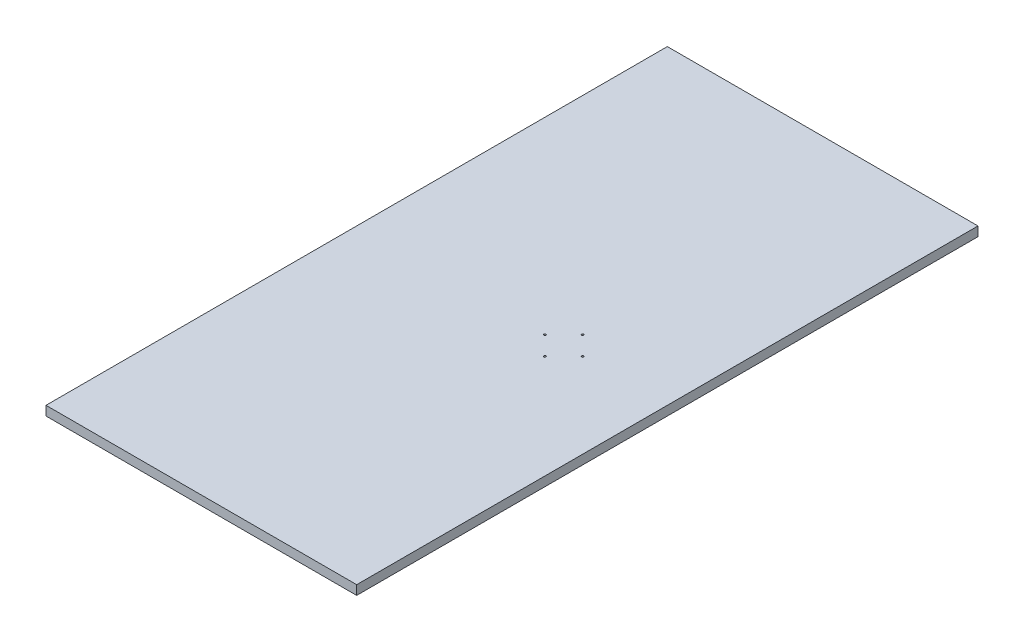
ISO-10303-21;
HEADER;
FILE_DESCRIPTION(('STEP AP214'),'2;1');
FILE_NAME('part.step','',(''),(''),'','','');
FILE_SCHEMA(('AUTOMOTIVE_DESIGN { 1 0 10303 214 1 1 1 1 }'));
ENDSEC;
DATA;
#1=APPLICATION_CONTEXT('core data for automotive mechanical design processes');
#2=APPLICATION_PROTOCOL_DEFINITION('international standard','automotive_design',2000,#1);
#3=PRODUCT_CONTEXT('',#1,'mechanical');
#4=PRODUCT('Part','Part','',(#3));
#5=PRODUCT_RELATED_PRODUCT_CATEGORY('part','',(#4));
#6=PRODUCT_DEFINITION_FORMATION('','',#4);
#7=PRODUCT_DEFINITION_CONTEXT('part definition',#1,'design');
#8=PRODUCT_DEFINITION('design','',#6,#7);
#9=PRODUCT_DEFINITION_SHAPE('','',#8);
#10=(LENGTH_UNIT() NAMED_UNIT(*) SI_UNIT(.MILLI.,.METRE.));
#11=(NAMED_UNIT(*) PLANE_ANGLE_UNIT() SI_UNIT($,.RADIAN.));
#12=(NAMED_UNIT(*) SI_UNIT($,.STERADIAN.) SOLID_ANGLE_UNIT());
#13=UNCERTAINTY_MEASURE_WITH_UNIT(LENGTH_MEASURE(1.E-05),#10,'distance_accuracy_value','');
#14=(GEOMETRIC_REPRESENTATION_CONTEXT(3) GLOBAL_UNCERTAINTY_ASSIGNED_CONTEXT((#13)) GLOBAL_UNIT_ASSIGNED_CONTEXT((#10,
#11,#12)) REPRESENTATION_CONTEXT('',''));
#15=CARTESIAN_POINT('',(0.,0.,0.));
#16=DIRECTION('',(0.,0.,1.));
#17=DIRECTION('',(1.,0.,0.));
#18=AXIS2_PLACEMENT_3D('',#15,#16,#17);
#19=CARTESIAN_POINT('',(300.,18.,600.));
#20=DIRECTION('',(-1.,0.,0.));
#21=DIRECTION('',(0.,0.,1.));
#22=AXIS2_PLACEMENT_3D('',#19,#20,#21);
#23=PLANE('',#22);
#24=DIRECTION('',(0.,0.,-1.));
#25=VECTOR('',#24,1.);
#26=CARTESIAN_POINT('',(300.,0.,600.));
#27=LINE('',#26,#25);
#28=CARTESIAN_POINT('',(300.,0.,600.));
#29=VERTEX_POINT('',#28);
#30=CARTESIAN_POINT('',(300.,0.,-600.));
#31=VERTEX_POINT('',#30);
#32=EDGE_CURVE('E102',#29,#31,#27,.T.);
#33=ORIENTED_EDGE('',*,*,#32,.T.);
#34=DIRECTION('',(0.,-1.,0.));
#35=VECTOR('',#34,1.);
#36=CARTESIAN_POINT('',(300.,18.,-600.));
#37=LINE('',#36,#35);
#38=CARTESIAN_POINT('',(300.,18.,-600.));
#39=VERTEX_POINT('',#38);
#40=EDGE_CURVE('E11',#39,#31,#37,.T.);
#41=ORIENTED_EDGE('',*,*,#40,.F.);
#42=DIRECTION('',(0.,0.,-1.));
#43=VECTOR('',#42,1.);
#44=CARTESIAN_POINT('',(300.,18.,600.));
#45=LINE('',#44,#43);
#46=CARTESIAN_POINT('',(300.,18.,600.));
#47=VERTEX_POINT('',#46);
#48=EDGE_CURVE('E90',#47,#39,#45,.T.);
#49=ORIENTED_EDGE('',*,*,#48,.F.);
#50=DIRECTION('',(0.,-1.,0.));
#51=VECTOR('',#50,1.);
#52=CARTESIAN_POINT('',(300.,18.,600.));
#53=LINE('',#52,#51);
#54=EDGE_CURVE('E98',#47,#29,#53,.T.);
#55=ORIENTED_EDGE('',*,*,#54,.T.);
#56=EDGE_LOOP('',(#33,#41,#49,#55));
#57=FACE_BOUND('',#56,.T.);
#58=ADVANCED_FACE('F39',(#57),#23,.F.);
#59=CARTESIAN_POINT('',(-300.,18.,-600.));
#60=DIRECTION('',(0.,0.,1.));
#61=DIRECTION('',(1.,0.,0.));
#62=AXIS2_PLACEMENT_3D('',#59,#60,#61);
#63=PLANE('',#62);
#64=DIRECTION('',(-1.,0.,0.));
#65=VECTOR('',#64,1.);
#66=CARTESIAN_POINT('',(-300.,0.,-600.));
#67=LINE('',#66,#65);
#68=CARTESIAN_POINT('',(-300.,0.,-600.));
#69=VERTEX_POINT('',#68);
#70=EDGE_CURVE('E94',#31,#69,#67,.T.);
#71=ORIENTED_EDGE('',*,*,#70,.T.);
#72=DIRECTION('',(0.,-1.,0.));
#73=VECTOR('',#72,1.);
#74=CARTESIAN_POINT('',(-300.,18.,-600.));
#75=LINE('',#74,#73);
#76=CARTESIAN_POINT('',(-300.,18.,-600.));
#77=VERTEX_POINT('',#76);
#78=EDGE_CURVE('E47',#77,#69,#75,.T.);
#79=ORIENTED_EDGE('',*,*,#78,.F.);
#80=DIRECTION('',(-1.,0.,0.));
#81=VECTOR('',#80,1.);
#82=CARTESIAN_POINT('',(-300.,18.,-600.));
#83=LINE('',#82,#81);
#84=EDGE_CURVE('E85',#39,#77,#83,.T.);
#85=ORIENTED_EDGE('',*,*,#84,.F.);
#86=ORIENTED_EDGE('',*,*,#40,.T.);
#87=EDGE_LOOP('',(#71,#79,#85,#86));
#88=FACE_BOUND('',#87,.T.);
#89=ADVANCED_FACE('F93',(#88),#63,.F.);
#90=CARTESIAN_POINT('',(-300.,18.,600.));
#91=DIRECTION('',(1.,0.,0.));
#92=DIRECTION('',(0.,0.,-1.));
#93=AXIS2_PLACEMENT_3D('',#90,#91,#92);
#94=PLANE('',#93);
#95=DIRECTION('',(0.,0.,1.));
#96=VECTOR('',#95,1.);
#97=CARTESIAN_POINT('',(-300.,0.,600.));
#98=LINE('',#97,#96);
#99=CARTESIAN_POINT('',(-300.,0.,600.));
#100=VERTEX_POINT('',#99);
#101=EDGE_CURVE('E72',#69,#100,#98,.T.);
#102=ORIENTED_EDGE('',*,*,#101,.T.);
#103=DIRECTION('',(0.,-1.,0.));
#104=VECTOR('',#103,1.);
#105=CARTESIAN_POINT('',(-300.,18.,600.));
#106=LINE('',#105,#104);
#107=CARTESIAN_POINT('',(-300.,18.,600.));
#108=VERTEX_POINT('',#107);
#109=EDGE_CURVE('E95',#108,#100,#106,.T.);
#110=ORIENTED_EDGE('',*,*,#109,.F.);
#111=DIRECTION('',(0.,0.,1.));
#112=VECTOR('',#111,1.);
#113=CARTESIAN_POINT('',(-300.,18.,600.));
#114=LINE('',#113,#112);
#115=EDGE_CURVE('E88',#77,#108,#114,.T.);
#116=ORIENTED_EDGE('',*,*,#115,.F.);
#117=ORIENTED_EDGE('',*,*,#78,.T.);
#118=EDGE_LOOP('',(#102,#110,#116,#117));
#119=FACE_BOUND('',#118,.T.);
#120=ADVANCED_FACE('F96',(#119),#94,.F.);
#121=CARTESIAN_POINT('',(-300.,18.,600.));
#122=DIRECTION('',(0.,0.,-1.));
#123=DIRECTION('',(-1.,0.,0.));
#124=AXIS2_PLACEMENT_3D('',#121,#122,#123);
#125=PLANE('',#124);
#126=DIRECTION('',(1.,0.,0.));
#127=VECTOR('',#126,1.);
#128=CARTESIAN_POINT('',(-300.,0.,600.));
#129=LINE('',#128,#127);
#130=EDGE_CURVE('E78',#100,#29,#129,.T.);
#131=ORIENTED_EDGE('',*,*,#130,.T.);
#132=ORIENTED_EDGE('',*,*,#54,.F.);
#133=DIRECTION('',(1.,0.,0.));
#134=VECTOR('',#133,1.);
#135=CARTESIAN_POINT('',(-300.,18.,600.));
#136=LINE('',#135,#134);
#137=EDGE_CURVE('E55',#108,#47,#136,.T.);
#138=ORIENTED_EDGE('',*,*,#137,.F.);
#139=ORIENTED_EDGE('',*,*,#109,.T.);
#140=EDGE_LOOP('',(#131,#132,#138,#139));
#141=FACE_BOUND('',#140,.T.);
#142=ADVANCED_FACE('F110',(#141),#125,.F.);
#143=CARTESIAN_POINT('',(0.,18.,0.));
#144=DIRECTION('',(0.,-1.,0.));
#145=DIRECTION('',(0.,0.,-1.));
#146=AXIS2_PLACEMENT_3D('',#143,#144,#145);
#147=PLANE('',#146);
#148=CARTESIAN_POINT('',(100.,18.,-36.5));
#149=DIRECTION('',(0.,1.,0.));
#150=DIRECTION('',(0.,0.,1.));
#151=AXIS2_PLACEMENT_3D('',#148,#149,#150);
#152=CIRCLE('',#151,2.);
#153=CARTESIAN_POINT('',(100.,18.,-34.5));
#154=VERTEX_POINT('',#153);
#155=EDGE_CURVE('E134',#154,#154,#152,.T.);
#156=ORIENTED_EDGE('',*,*,#155,.F.);
#157=EDGE_LOOP('',(#156));
#158=FACE_BOUND('',#157,.T.);
#159=CARTESIAN_POINT('',(100.,18.,36.5));
#160=DIRECTION('',(0.,1.,0.));
#161=DIRECTION('',(0.,0.,1.));
#162=AXIS2_PLACEMENT_3D('',#159,#160,#161);
#163=CIRCLE('',#162,2.);
#164=CARTESIAN_POINT('',(100.,18.,38.5));
#165=VERTEX_POINT('',#164);
#166=EDGE_CURVE('E128',#165,#165,#163,.T.);
#167=ORIENTED_EDGE('',*,*,#166,.F.);
#168=EDGE_LOOP('',(#167));
#169=FACE_BOUND('',#168,.T.);
#170=CARTESIAN_POINT('',(136.5,18.,0.));
#171=DIRECTION('',(0.,1.,0.));
#172=DIRECTION('',(0.,0.,1.));
#173=AXIS2_PLACEMENT_3D('',#170,#171,#172);
#174=CIRCLE('',#173,2.);
#175=CARTESIAN_POINT('',(136.5,18.,2.));
#176=VERTEX_POINT('',#175);
#177=EDGE_CURVE('E122',#176,#176,#174,.T.);
#178=ORIENTED_EDGE('',*,*,#177,.F.);
#179=EDGE_LOOP('',(#178));
#180=FACE_BOUND('',#179,.T.);
#181=CARTESIAN_POINT('',(63.5000000000001,18.,0.));
#182=DIRECTION('',(0.,1.,0.));
#183=DIRECTION('',(0.,0.,1.));
#184=AXIS2_PLACEMENT_3D('',#181,#182,#183);
#185=CIRCLE('',#184,2.);
#186=CARTESIAN_POINT('',(63.5000000000001,18.,2.));
#187=VERTEX_POINT('',#186);
#188=EDGE_CURVE('E116',#187,#187,#185,.T.);
#189=ORIENTED_EDGE('',*,*,#188,.F.);
#190=EDGE_LOOP('',(#189));
#191=FACE_BOUND('',#190,.T.);
#192=ORIENTED_EDGE('',*,*,#48,.T.);
#193=ORIENTED_EDGE('',*,*,#84,.T.);
#194=ORIENTED_EDGE('',*,*,#115,.T.);
#195=ORIENTED_EDGE('',*,*,#137,.T.);
#196=EDGE_LOOP('',(#192,#193,#194,#195));
#197=FACE_BOUND('',#196,.T.);
#198=ADVANCED_FACE('F86',(#158,#169,#180,#191,#197),#147,.F.);
#199=CARTESIAN_POINT('',(0.,0.,0.));
#200=DIRECTION('',(0.,-1.,0.));
#201=DIRECTION('',(0.,0.,-1.));
#202=AXIS2_PLACEMENT_3D('',#199,#200,#201);
#203=PLANE('',#202);
#204=CARTESIAN_POINT('',(100.,0.,-36.5));
#205=DIRECTION('',(0.,1.,0.));
#206=DIRECTION('',(0.,0.,1.));
#207=AXIS2_PLACEMENT_3D('',#204,#205,#206);
#208=CIRCLE('',#207,2.);
#209=CARTESIAN_POINT('',(100.,0.,-34.5));
#210=VERTEX_POINT('',#209);
#211=EDGE_CURVE('E105',#210,#210,#208,.T.);
#212=ORIENTED_EDGE('',*,*,#211,.T.);
#213=EDGE_LOOP('',(#212));
#214=FACE_BOUND('',#213,.T.);
#215=CARTESIAN_POINT('',(100.,0.,36.5));
#216=DIRECTION('',(0.,1.,0.));
#217=DIRECTION('',(0.,0.,1.));
#218=AXIS2_PLACEMENT_3D('',#215,#216,#217);
#219=CIRCLE('',#218,2.);
#220=CARTESIAN_POINT('',(100.,0.,38.5));
#221=VERTEX_POINT('',#220);
#222=EDGE_CURVE('E131',#221,#221,#219,.T.);
#223=ORIENTED_EDGE('',*,*,#222,.T.);
#224=EDGE_LOOP('',(#223));
#225=FACE_BOUND('',#224,.T.);
#226=CARTESIAN_POINT('',(136.5,0.,0.));
#227=DIRECTION('',(0.,1.,0.));
#228=DIRECTION('',(0.,0.,1.));
#229=AXIS2_PLACEMENT_3D('',#226,#227,#228);
#230=CIRCLE('',#229,2.);
#231=CARTESIAN_POINT('',(136.5,0.,2.));
#232=VERTEX_POINT('',#231);
#233=EDGE_CURVE('E125',#232,#232,#230,.T.);
#234=ORIENTED_EDGE('',*,*,#233,.T.);
#235=EDGE_LOOP('',(#234));
#236=FACE_BOUND('',#235,.T.);
#237=CARTESIAN_POINT('',(63.5000000000001,0.,0.));
#238=DIRECTION('',(0.,1.,0.));
#239=DIRECTION('',(0.,0.,1.));
#240=AXIS2_PLACEMENT_3D('',#237,#238,#239);
#241=CIRCLE('',#240,2.);
#242=CARTESIAN_POINT('',(63.5000000000001,0.,2.));
#243=VERTEX_POINT('',#242);
#244=EDGE_CURVE('E119',#243,#243,#241,.T.);
#245=ORIENTED_EDGE('',*,*,#244,.T.);
#246=EDGE_LOOP('',(#245));
#247=FACE_BOUND('',#246,.T.);
#248=ORIENTED_EDGE('',*,*,#32,.F.);
#249=ORIENTED_EDGE('',*,*,#130,.F.);
#250=ORIENTED_EDGE('',*,*,#101,.F.);
#251=ORIENTED_EDGE('',*,*,#70,.F.);
#252=EDGE_LOOP('',(#248,#249,#250,#251));
#253=FACE_BOUND('',#252,.T.);
#254=ADVANCED_FACE('F113',(#214,#225,#236,#247,#253),#203,.T.);
#255=CARTESIAN_POINT('',(63.5000000000001,0.,0.));
#256=DIRECTION('',(0.,1.,0.));
#257=DIRECTION('',(0.,0.,1.));
#258=AXIS2_PLACEMENT_3D('',#255,#256,#257);
#259=CYLINDRICAL_SURFACE('',#258,2.);
#260=ORIENTED_EDGE('',*,*,#244,.F.);
#261=EDGE_LOOP('',(#260));
#262=FACE_BOUND('',#261,.T.);
#263=ORIENTED_EDGE('',*,*,#188,.T.);
#264=EDGE_LOOP('',(#263));
#265=FACE_BOUND('',#264,.T.);
#266=ADVANCED_FACE('F158',(#262,#265),#259,.F.);
#267=CARTESIAN_POINT('',(136.5,0.,0.));
#268=DIRECTION('',(0.,1.,0.));
#269=DIRECTION('',(0.,0.,1.));
#270=AXIS2_PLACEMENT_3D('',#267,#268,#269);
#271=CYLINDRICAL_SURFACE('',#270,2.);
#272=ORIENTED_EDGE('',*,*,#233,.F.);
#273=EDGE_LOOP('',(#272));
#274=FACE_BOUND('',#273,.T.);
#275=ORIENTED_EDGE('',*,*,#177,.T.);
#276=EDGE_LOOP('',(#275));
#277=FACE_BOUND('',#276,.T.);
#278=ADVANCED_FACE('F160',(#274,#277),#271,.F.);
#279=CARTESIAN_POINT('',(100.,0.,36.5));
#280=DIRECTION('',(0.,1.,0.));
#281=DIRECTION('',(0.,0.,1.));
#282=AXIS2_PLACEMENT_3D('',#279,#280,#281);
#283=CYLINDRICAL_SURFACE('',#282,2.);
#284=ORIENTED_EDGE('',*,*,#222,.F.);
#285=EDGE_LOOP('',(#284));
#286=FACE_BOUND('',#285,.T.);
#287=ORIENTED_EDGE('',*,*,#166,.T.);
#288=EDGE_LOOP('',(#287));
#289=FACE_BOUND('',#288,.T.);
#290=ADVANCED_FACE('F145',(#286,#289),#283,.F.);
#291=CARTESIAN_POINT('',(100.,0.,-36.5));
#292=DIRECTION('',(0.,1.,0.));
#293=DIRECTION('',(0.,0.,1.));
#294=AXIS2_PLACEMENT_3D('',#291,#292,#293);
#295=CYLINDRICAL_SURFACE('',#294,2.);
#296=ORIENTED_EDGE('',*,*,#211,.F.);
#297=EDGE_LOOP('',(#296));
#298=FACE_BOUND('',#297,.T.);
#299=ORIENTED_EDGE('',*,*,#155,.T.);
#300=EDGE_LOOP('',(#299));
#301=FACE_BOUND('',#300,.T.);
#302=ADVANCED_FACE('F142',(#298,#301),#295,.F.);
#303=CLOSED_SHELL('',(#58,#89,#120,#142,#198,#254,#266,#278,#290,#302));
#304=MANIFOLD_SOLID_BREP('B2',#303);
#305=ADVANCED_BREP_SHAPE_REPRESENTATION('',(#18,#304),#14);
#306=SHAPE_DEFINITION_REPRESENTATION(#9,#305);
ENDSEC;
END-ISO-10303-21;
